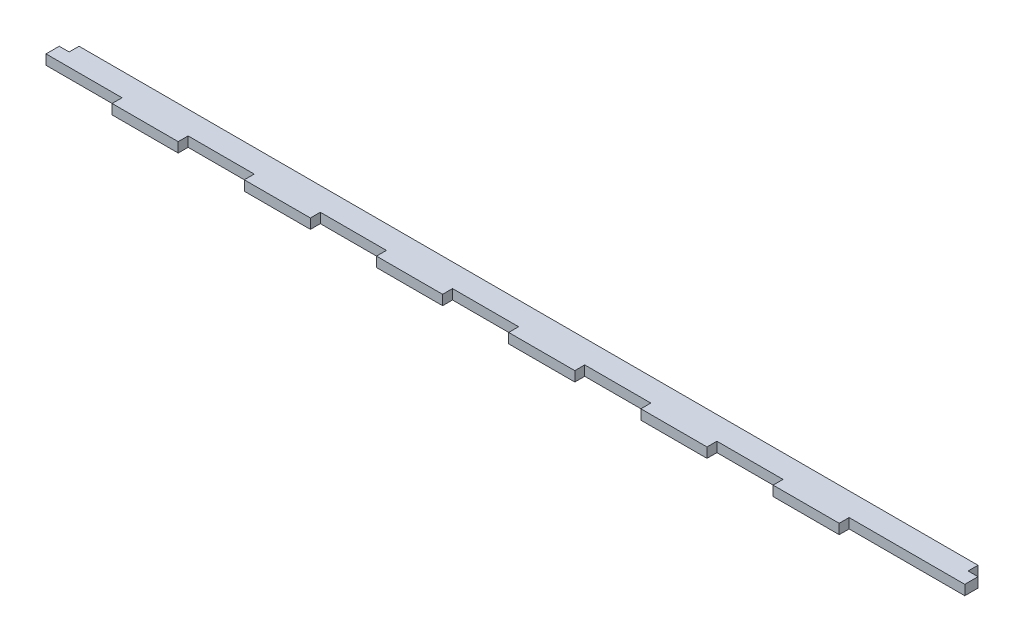
ISO-10303-21;
HEADER;
FILE_DESCRIPTION(('STEP AP214'),'2;1');
FILE_NAME('part.step','',(''),(''),'','','');
FILE_SCHEMA(('AUTOMOTIVE_DESIGN { 1 0 10303 214 1 1 1 1 }'));
ENDSEC;
DATA;
#1=APPLICATION_CONTEXT('core data for automotive mechanical design processes');
#2=APPLICATION_PROTOCOL_DEFINITION('international standard','automotive_design',2000,#1);
#3=PRODUCT_CONTEXT('',#1,'mechanical');
#4=PRODUCT('Part','Part','',(#3));
#5=PRODUCT_RELATED_PRODUCT_CATEGORY('part','',(#4));
#6=PRODUCT_DEFINITION_FORMATION('','',#4);
#7=PRODUCT_DEFINITION_CONTEXT('part definition',#1,'design');
#8=PRODUCT_DEFINITION('design','',#6,#7);
#9=PRODUCT_DEFINITION_SHAPE('','',#8);
#10=(LENGTH_UNIT() NAMED_UNIT(*) SI_UNIT(.MILLI.,.METRE.));
#11=(NAMED_UNIT(*) PLANE_ANGLE_UNIT() SI_UNIT($,.RADIAN.));
#12=(NAMED_UNIT(*) SI_UNIT($,.STERADIAN.) SOLID_ANGLE_UNIT());
#13=UNCERTAINTY_MEASURE_WITH_UNIT(LENGTH_MEASURE(1.E-05),#10,'distance_accuracy_value','');
#14=(GEOMETRIC_REPRESENTATION_CONTEXT(3) GLOBAL_UNCERTAINTY_ASSIGNED_CONTEXT((#13)) GLOBAL_UNIT_ASSIGNED_CONTEXT((#10,
#11,#12)) REPRESENTATION_CONTEXT('',''));
#15=CARTESIAN_POINT('',(0.,0.,0.));
#16=DIRECTION('',(0.,0.,1.));
#17=DIRECTION('',(1.,0.,0.));
#18=AXIS2_PLACEMENT_3D('',#15,#16,#17);
#19=CARTESIAN_POINT('',(0.,6.,0.));
#20=DIRECTION('',(1.,0.,0.));
#21=DIRECTION('',(0.,0.,-1.));
#22=AXIS2_PLACEMENT_3D('',#19,#20,#21);
#23=PLANE('',#22);
#24=DIRECTION('',(0.,-1.,0.));
#25=VECTOR('',#24,1.);
#26=CARTESIAN_POINT('',(0.,6.,-14.));
#27=LINE('',#26,#25);
#28=CARTESIAN_POINT('',(0.,6.,-14.));
#29=VERTEX_POINT('',#28);
#30=CARTESIAN_POINT('',(0.,0.,-14.));
#31=VERTEX_POINT('',#30);
#32=EDGE_CURVE('E56',#29,#31,#27,.T.);
#33=ORIENTED_EDGE('',*,*,#32,.F.);
#34=DIRECTION('',(0.,0.,1.));
#35=VECTOR('',#34,1.);
#36=CARTESIAN_POINT('',(0.,6.,0.));
#37=LINE('',#36,#35);
#38=CARTESIAN_POINT('',(0.,6.,-20.));
#39=VERTEX_POINT('',#38);
#40=EDGE_CURVE('E443',#39,#29,#37,.T.);
#41=ORIENTED_EDGE('',*,*,#40,.F.);
#42=DIRECTION('',(0.,-1.,0.));
#43=VECTOR('',#42,1.);
#44=CARTESIAN_POINT('',(0.,6.,-20.));
#45=LINE('',#44,#43);
#46=CARTESIAN_POINT('',(0.,0.,-20.));
#47=VERTEX_POINT('',#46);
#48=EDGE_CURVE('E41',#39,#47,#45,.T.);
#49=ORIENTED_EDGE('',*,*,#48,.T.);
#50=DIRECTION('',(0.,0.,1.));
#51=VECTOR('',#50,1.);
#52=CARTESIAN_POINT('',(0.,0.,0.));
#53=LINE('',#52,#51);
#54=EDGE_CURVE('E442',#47,#31,#53,.T.);
#55=ORIENTED_EDGE('',*,*,#54,.T.);
#56=EDGE_LOOP('',(#33,#41,#49,#55));
#57=FACE_BOUND('',#56,.T.);
#58=ADVANCED_FACE('F34',(#57),#23,.F.);
#59=CARTESIAN_POINT('',(0.,6.,0.));
#60=DIRECTION('',(0.,0.,-1.));
#61=DIRECTION('',(-1.,0.,0.));
#62=AXIS2_PLACEMENT_3D('',#59,#60,#61);
#63=PLANE('',#62);
#64=DIRECTION('',(0.,-1.,0.));
#65=VECTOR('',#64,1.);
#66=CARTESIAN_POINT('',(160.,6.,0.));
#67=LINE('',#66,#65);
#68=CARTESIAN_POINT('',(160.,6.,0.));
#69=VERTEX_POINT('',#68);
#70=CARTESIAN_POINT('',(160.,0.,0.));
#71=VERTEX_POINT('',#70);
#72=EDGE_CURVE('E320',#69,#71,#67,.T.);
#73=ORIENTED_EDGE('',*,*,#72,.F.);
#74=DIRECTION('',(1.,0.,0.));
#75=VECTOR('',#74,1.);
#76=CARTESIAN_POINT('',(0.,6.,0.));
#77=LINE('',#76,#75);
#78=CARTESIAN_POINT('',(120.,6.,0.));
#79=VERTEX_POINT('',#78);
#80=EDGE_CURVE('E451',#79,#69,#77,.T.);
#81=ORIENTED_EDGE('',*,*,#80,.F.);
#82=DIRECTION('',(0.,-1.,0.));
#83=VECTOR('',#82,1.);
#84=CARTESIAN_POINT('',(120.,6.,0.));
#85=LINE('',#84,#83);
#86=CARTESIAN_POINT('',(120.,0.,0.));
#87=VERTEX_POINT('',#86);
#88=EDGE_CURVE('E423',#79,#87,#85,.T.);
#89=ORIENTED_EDGE('',*,*,#88,.T.);
#90=DIRECTION('',(1.,0.,0.));
#91=VECTOR('',#90,1.);
#92=CARTESIAN_POINT('',(0.,0.,0.));
#93=LINE('',#92,#91);
#94=EDGE_CURVE('E461',#87,#71,#93,.T.);
#95=ORIENTED_EDGE('',*,*,#94,.T.);
#96=EDGE_LOOP('',(#73,#81,#89,#95));
#97=FACE_BOUND('',#96,.T.);
#98=ADVANCED_FACE('F495',(#97),#63,.F.);
#99=DIRECTION('',(0.,-1.,0.));
#100=VECTOR('',#99,1.);
#101=CARTESIAN_POINT('',(200.,6.,0.));
#102=LINE('',#101,#100);
#103=CARTESIAN_POINT('',(200.,6.,0.));
#104=VERTEX_POINT('',#103);
#105=CARTESIAN_POINT('',(200.,0.,0.));
#106=VERTEX_POINT('',#105);
#107=EDGE_CURVE('E317',#104,#106,#102,.T.);
#108=ORIENTED_EDGE('',*,*,#107,.T.);
#109=CARTESIAN_POINT('',(240.,0.,0.));
#110=VERTEX_POINT('',#109);
#111=EDGE_CURVE('E539',#106,#110,#93,.T.);
#112=ORIENTED_EDGE('',*,*,#111,.T.);
#113=DIRECTION('',(0.,-1.,0.));
#114=VECTOR('',#113,1.);
#115=CARTESIAN_POINT('',(240.,6.,0.));
#116=LINE('',#115,#114);
#117=CARTESIAN_POINT('',(240.,6.,0.));
#118=VERTEX_POINT('',#117);
#119=EDGE_CURVE('E308',#118,#110,#116,.T.);
#120=ORIENTED_EDGE('',*,*,#119,.F.);
#121=EDGE_CURVE('E564',#104,#118,#77,.T.);
#122=ORIENTED_EDGE('',*,*,#121,.F.);
#123=EDGE_LOOP('',(#108,#112,#120,#122));
#124=FACE_BOUND('',#123,.T.);
#125=ADVANCED_FACE('F499',(#124),#63,.F.);
#126=DIRECTION('',(0.,-1.,0.));
#127=VECTOR('',#126,1.);
#128=CARTESIAN_POINT('',(280.,6.,0.));
#129=LINE('',#128,#127);
#130=CARTESIAN_POINT('',(280.,6.,0.));
#131=VERTEX_POINT('',#130);
#132=CARTESIAN_POINT('',(280.,0.,0.));
#133=VERTEX_POINT('',#132);
#134=EDGE_CURVE('E344',#131,#133,#129,.T.);
#135=ORIENTED_EDGE('',*,*,#134,.T.);
#136=CARTESIAN_POINT('',(320.,0.,0.));
#137=VERTEX_POINT('',#136);
#138=EDGE_CURVE('E535',#133,#137,#93,.T.);
#139=ORIENTED_EDGE('',*,*,#138,.T.);
#140=DIRECTION('',(0.,-1.,0.));
#141=VECTOR('',#140,1.);
#142=CARTESIAN_POINT('',(320.,6.,0.));
#143=LINE('',#142,#141);
#144=CARTESIAN_POINT('',(320.,6.,0.));
#145=VERTEX_POINT('',#144);
#146=EDGE_CURVE('E335',#145,#137,#143,.T.);
#147=ORIENTED_EDGE('',*,*,#146,.F.);
#148=EDGE_CURVE('E565',#131,#145,#77,.T.);
#149=ORIENTED_EDGE('',*,*,#148,.F.);
#150=EDGE_LOOP('',(#135,#139,#147,#149));
#151=FACE_BOUND('',#150,.T.);
#152=ADVANCED_FACE('F505',(#151),#63,.F.);
#153=DIRECTION('',(0.,-1.,0.));
#154=VECTOR('',#153,1.);
#155=CARTESIAN_POINT('',(360.,6.,0.));
#156=LINE('',#155,#154);
#157=CARTESIAN_POINT('',(360.,6.,0.));
#158=VERTEX_POINT('',#157);
#159=CARTESIAN_POINT('',(360.,0.,0.));
#160=VERTEX_POINT('',#159);
#161=EDGE_CURVE('E369',#158,#160,#156,.T.);
#162=ORIENTED_EDGE('',*,*,#161,.T.);
#163=CARTESIAN_POINT('',(400.,0.,0.));
#164=VERTEX_POINT('',#163);
#165=EDGE_CURVE('E533',#160,#164,#93,.T.);
#166=ORIENTED_EDGE('',*,*,#165,.T.);
#167=DIRECTION('',(0.,-1.,0.));
#168=VECTOR('',#167,1.);
#169=CARTESIAN_POINT('',(400.,6.,0.));
#170=LINE('',#169,#168);
#171=CARTESIAN_POINT('',(400.,6.,0.));
#172=VERTEX_POINT('',#171);
#173=EDGE_CURVE('E360',#172,#164,#170,.T.);
#174=ORIENTED_EDGE('',*,*,#173,.F.);
#175=EDGE_CURVE('E568',#158,#172,#77,.T.);
#176=ORIENTED_EDGE('',*,*,#175,.F.);
#177=EDGE_LOOP('',(#162,#166,#174,#176));
#178=FACE_BOUND('',#177,.T.);
#179=ADVANCED_FACE('F519',(#178),#63,.F.);
#180=DIRECTION('',(0.,-1.,0.));
#181=VECTOR('',#180,1.);
#182=CARTESIAN_POINT('',(440.,6.,0.));
#183=LINE('',#182,#181);
#184=CARTESIAN_POINT('',(440.,6.,0.));
#185=VERTEX_POINT('',#184);
#186=CARTESIAN_POINT('',(440.,0.,0.));
#187=VERTEX_POINT('',#186);
#188=EDGE_CURVE('E394',#185,#187,#183,.T.);
#189=ORIENTED_EDGE('',*,*,#188,.T.);
#190=CARTESIAN_POINT('',(480.,0.,0.));
#191=VERTEX_POINT('',#190);
#192=EDGE_CURVE('E456',#187,#191,#93,.T.);
#193=ORIENTED_EDGE('',*,*,#192,.T.);
#194=DIRECTION('',(0.,-1.,0.));
#195=VECTOR('',#194,1.);
#196=CARTESIAN_POINT('',(480.,6.,0.));
#197=LINE('',#196,#195);
#198=CARTESIAN_POINT('',(480.,6.,0.));
#199=VERTEX_POINT('',#198);
#200=EDGE_CURVE('E385',#199,#191,#197,.T.);
#201=ORIENTED_EDGE('',*,*,#200,.F.);
#202=EDGE_CURVE('E445',#185,#199,#77,.T.);
#203=ORIENTED_EDGE('',*,*,#202,.F.);
#204=EDGE_LOOP('',(#189,#193,#201,#203));
#205=FACE_BOUND('',#204,.T.);
#206=ADVANCED_FACE('F511',(#205),#63,.F.);
#207=CARTESIAN_POINT('',(0.,6.,0.));
#208=DIRECTION('',(0.,-1.,0.));
#209=DIRECTION('',(0.,0.,-1.));
#210=AXIS2_PLACEMENT_3D('',#207,#208,#209);
#211=PLANE('',#210);
#212=DIRECTION('',(-1.,0.,0.));
#213=VECTOR('',#212,1.);
#214=CARTESIAN_POINT('',(480.,6.,-5.99999999999999));
#215=LINE('',#214,#213);
#216=CARTESIAN_POINT('',(550.,6.,-6.));
#217=VERTEX_POINT('',#216);
#218=CARTESIAN_POINT('',(480.,6.,-5.99999999999999));
#219=VERTEX_POINT('',#218);
#220=EDGE_CURVE('E244',#217,#219,#215,.T.);
#221=ORIENTED_EDGE('',*,*,#220,.F.);
#222=DIRECTION('',(0.,0.,-1.));
#223=VECTOR('',#222,1.);
#224=CARTESIAN_POINT('',(550.,6.,-6.));
#225=LINE('',#224,#223);
#226=CARTESIAN_POINT('',(550.,6.,-14.));
#227=VERTEX_POINT('',#226);
#228=EDGE_CURVE('E248',#217,#227,#225,.T.);
#229=ORIENTED_EDGE('',*,*,#228,.T.);
#230=DIRECTION('',(-1.,0.,0.));
#231=VECTOR('',#230,1.);
#232=CARTESIAN_POINT('',(544.,6.,-14.));
#233=LINE('',#232,#231);
#234=CARTESIAN_POINT('',(544.,6.,-14.));
#235=VERTEX_POINT('',#234);
#236=EDGE_CURVE('E269',#227,#235,#233,.T.);
#237=ORIENTED_EDGE('',*,*,#236,.T.);
#238=DIRECTION('',(0.,0.,-1.));
#239=VECTOR('',#238,1.);
#240=CARTESIAN_POINT('',(544.,6.,0.));
#241=LINE('',#240,#239);
#242=CARTESIAN_POINT('',(544.,6.,-20.));
#243=VERTEX_POINT('',#242);
#244=EDGE_CURVE('E450',#235,#243,#241,.T.);
#245=ORIENTED_EDGE('',*,*,#244,.T.);
#246=DIRECTION('',(-1.,0.,0.));
#247=VECTOR('',#246,1.);
#248=CARTESIAN_POINT('',(0.,6.,-20.));
#249=LINE('',#248,#247);
#250=EDGE_CURVE('E453',#243,#39,#249,.T.);
#251=ORIENTED_EDGE('',*,*,#250,.T.);
#252=ORIENTED_EDGE('',*,*,#40,.T.);
#253=DIRECTION('',(-1.,0.,0.));
#254=VECTOR('',#253,1.);
#255=CARTESIAN_POINT('',(0.,6.,-14.));
#256=LINE('',#255,#254);
#257=CARTESIAN_POINT('',(-6.,6.,-14.));
#258=VERTEX_POINT('',#257);
#259=EDGE_CURVE('E279',#29,#258,#256,.T.);
#260=ORIENTED_EDGE('',*,*,#259,.T.);
#261=DIRECTION('',(0.,0.,1.));
#262=VECTOR('',#261,1.);
#263=CARTESIAN_POINT('',(-6.,6.,-14.));
#264=LINE('',#263,#262);
#265=CARTESIAN_POINT('',(-6.,6.,-6.));
#266=VERTEX_POINT('',#265);
#267=EDGE_CURVE('E281',#258,#266,#264,.T.);
#268=ORIENTED_EDGE('',*,*,#267,.T.);
#269=DIRECTION('',(-1.,0.,0.));
#270=VECTOR('',#269,1.);
#271=CARTESIAN_POINT('',(0.,6.,-5.99999999999999));
#272=LINE('',#271,#270);
#273=CARTESIAN_POINT('',(40.,6.,-6.));
#274=VERTEX_POINT('',#273);
#275=EDGE_CURVE('E431',#274,#266,#272,.T.);
#276=ORIENTED_EDGE('',*,*,#275,.F.);
#277=DIRECTION('',(0.,0.,-1.));
#278=VECTOR('',#277,1.);
#279=CARTESIAN_POINT('',(40.,6.,0.));
#280=LINE('',#279,#278);
#281=CARTESIAN_POINT('',(40.,6.,0.));
#282=VERTEX_POINT('',#281);
#283=EDGE_CURVE('E429',#282,#274,#280,.T.);
#284=ORIENTED_EDGE('',*,*,#283,.F.);
#285=CARTESIAN_POINT('',(80.,6.,0.));
#286=VERTEX_POINT('',#285);
#287=EDGE_CURVE('E447',#282,#286,#77,.T.);
#288=ORIENTED_EDGE('',*,*,#287,.T.);
#289=DIRECTION('',(0.,0.,1.));
#290=VECTOR('',#289,1.);
#291=CARTESIAN_POINT('',(80.,6.,0.));
#292=LINE('',#291,#290);
#293=CARTESIAN_POINT('',(80.,6.,-5.99999999999999));
#294=VERTEX_POINT('',#293);
#295=EDGE_CURVE('E404',#294,#286,#292,.T.);
#296=ORIENTED_EDGE('',*,*,#295,.F.);
#297=DIRECTION('',(-1.,0.,0.));
#298=VECTOR('',#297,1.);
#299=CARTESIAN_POINT('',(80.,6.,-5.99999999999999));
#300=LINE('',#299,#298);
#301=CARTESIAN_POINT('',(120.,6.,-6.));
#302=VERTEX_POINT('',#301);
#303=EDGE_CURVE('E409',#302,#294,#300,.T.);
#304=ORIENTED_EDGE('',*,*,#303,.F.);
#305=DIRECTION('',(0.,0.,-1.));
#306=VECTOR('',#305,1.);
#307=CARTESIAN_POINT('',(120.,6.,0.));
#308=LINE('',#307,#306);
#309=EDGE_CURVE('E406',#79,#302,#308,.T.);
#310=ORIENTED_EDGE('',*,*,#309,.F.);
#311=ORIENTED_EDGE('',*,*,#80,.T.);
#312=DIRECTION('',(0.,0.,1.));
#313=VECTOR('',#312,1.);
#314=CARTESIAN_POINT('',(160.,6.,0.));
#315=LINE('',#314,#313);
#316=CARTESIAN_POINT('',(160.,6.,-5.99999999999999));
#317=VERTEX_POINT('',#316);
#318=EDGE_CURVE('E296',#317,#69,#315,.T.);
#319=ORIENTED_EDGE('',*,*,#318,.F.);
#320=DIRECTION('',(-1.,0.,0.));
#321=VECTOR('',#320,1.);
#322=CARTESIAN_POINT('',(160.,6.,-5.99999999999999));
#323=LINE('',#322,#321);
#324=CARTESIAN_POINT('',(200.,6.,-6.));
#325=VERTEX_POINT('',#324);
#326=EDGE_CURVE('E301',#325,#317,#323,.T.);
#327=ORIENTED_EDGE('',*,*,#326,.F.);
#328=DIRECTION('',(0.,0.,-1.));
#329=VECTOR('',#328,1.);
#330=CARTESIAN_POINT('',(200.,6.,0.));
#331=LINE('',#330,#329);
#332=EDGE_CURVE('E298',#104,#325,#331,.T.);
#333=ORIENTED_EDGE('',*,*,#332,.F.);
#334=ORIENTED_EDGE('',*,*,#121,.T.);
#335=DIRECTION('',(0.,0.,1.));
#336=VECTOR('',#335,1.);
#337=CARTESIAN_POINT('',(240.,6.,0.));
#338=LINE('',#337,#336);
#339=CARTESIAN_POINT('',(240.,6.,-5.99999999999999));
#340=VERTEX_POINT('',#339);
#341=EDGE_CURVE('E323',#340,#118,#338,.T.);
#342=ORIENTED_EDGE('',*,*,#341,.F.);
#343=DIRECTION('',(-1.,0.,0.));
#344=VECTOR('',#343,1.);
#345=CARTESIAN_POINT('',(240.,6.,-5.99999999999999));
#346=LINE('',#345,#344);
#347=CARTESIAN_POINT('',(280.,6.,-6.));
#348=VERTEX_POINT('',#347);
#349=EDGE_CURVE('E328',#348,#340,#346,.T.);
#350=ORIENTED_EDGE('',*,*,#349,.F.);
#351=DIRECTION('',(0.,0.,-1.));
#352=VECTOR('',#351,1.);
#353=CARTESIAN_POINT('',(280.,6.,0.));
#354=LINE('',#353,#352);
#355=EDGE_CURVE('E325',#131,#348,#354,.T.);
#356=ORIENTED_EDGE('',*,*,#355,.F.);
#357=ORIENTED_EDGE('',*,*,#148,.T.);
#358=DIRECTION('',(0.,0.,1.));
#359=VECTOR('',#358,1.);
#360=CARTESIAN_POINT('',(320.,6.,0.));
#361=LINE('',#360,#359);
#362=CARTESIAN_POINT('',(320.,6.,-5.99999999999999));
#363=VERTEX_POINT('',#362);
#364=EDGE_CURVE('E348',#363,#145,#361,.T.);
#365=ORIENTED_EDGE('',*,*,#364,.F.);
#366=DIRECTION('',(-1.,0.,0.));
#367=VECTOR('',#366,1.);
#368=CARTESIAN_POINT('',(320.,6.,-5.99999999999999));
#369=LINE('',#368,#367);
#370=CARTESIAN_POINT('',(360.,6.,-6.));
#371=VERTEX_POINT('',#370);
#372=EDGE_CURVE('E353',#371,#363,#369,.T.);
#373=ORIENTED_EDGE('',*,*,#372,.F.);
#374=DIRECTION('',(0.,0.,-1.));
#375=VECTOR('',#374,1.);
#376=CARTESIAN_POINT('',(360.,6.,0.));
#377=LINE('',#376,#375);
#378=EDGE_CURVE('E350',#158,#371,#377,.T.);
#379=ORIENTED_EDGE('',*,*,#378,.F.);
#380=ORIENTED_EDGE('',*,*,#175,.T.);
#381=DIRECTION('',(0.,0.,1.));
#382=VECTOR('',#381,1.);
#383=CARTESIAN_POINT('',(400.,6.,0.));
#384=LINE('',#383,#382);
#385=CARTESIAN_POINT('',(400.,6.,-5.99999999999999));
#386=VERTEX_POINT('',#385);
#387=EDGE_CURVE('E373',#386,#172,#384,.T.);
#388=ORIENTED_EDGE('',*,*,#387,.F.);
#389=DIRECTION('',(-1.,0.,0.));
#390=VECTOR('',#389,1.);
#391=CARTESIAN_POINT('',(400.,6.,-5.99999999999999));
#392=LINE('',#391,#390);
#393=CARTESIAN_POINT('',(440.,6.,-6.));
#394=VERTEX_POINT('',#393);
#395=EDGE_CURVE('E378',#394,#386,#392,.T.);
#396=ORIENTED_EDGE('',*,*,#395,.F.);
#397=DIRECTION('',(0.,0.,-1.));
#398=VECTOR('',#397,1.);
#399=CARTESIAN_POINT('',(440.,6.,0.));
#400=LINE('',#399,#398);
#401=EDGE_CURVE('E375',#185,#394,#400,.T.);
#402=ORIENTED_EDGE('',*,*,#401,.F.);
#403=ORIENTED_EDGE('',*,*,#202,.T.);
#404=DIRECTION('',(0.,0.,1.));
#405=VECTOR('',#404,1.);
#406=CARTESIAN_POINT('',(480.,6.,0.));
#407=LINE('',#406,#405);
#408=EDGE_CURVE('E251',#219,#199,#407,.T.);
#409=ORIENTED_EDGE('',*,*,#408,.F.);
#410=EDGE_LOOP('',(#221,#229,#237,#245,#251,#252,#260,#268,#276,#284,#288,#296,#304,#310,#311,
#319,#327,#333,#334,#342,#350,#356,#357,#365,#373,#379,#380,#388,#396,#402,#403,#409));
#411=FACE_BOUND('',#410,.T.);
#412=ADVANCED_FACE('F246',(#411),#211,.F.);
#413=CARTESIAN_POINT('',(0.,0.,0.));
#414=DIRECTION('',(0.,-1.,0.));
#415=DIRECTION('',(0.,0.,-1.));
#416=AXIS2_PLACEMENT_3D('',#413,#414,#415);
#417=PLANE('',#416);
#418=DIRECTION('',(0.,0.,-1.));
#419=VECTOR('',#418,1.);
#420=CARTESIAN_POINT('',(544.,0.,0.));
#421=LINE('',#420,#419);
#422=CARTESIAN_POINT('',(544.,0.,-14.));
#423=VERTEX_POINT('',#422);
#424=CARTESIAN_POINT('',(544.,0.,-20.));
#425=VERTEX_POINT('',#424);
#426=EDGE_CURVE('E460',#423,#425,#421,.T.);
#427=ORIENTED_EDGE('',*,*,#426,.F.);
#428=DIRECTION('',(-1.,0.,0.));
#429=VECTOR('',#428,1.);
#430=CARTESIAN_POINT('',(544.,0.,-14.));
#431=LINE('',#430,#429);
#432=CARTESIAN_POINT('',(550.,0.,-14.));
#433=VERTEX_POINT('',#432);
#434=EDGE_CURVE('E48',#433,#423,#431,.T.);
#435=ORIENTED_EDGE('',*,*,#434,.F.);
#436=DIRECTION('',(0.,0.,-1.));
#437=VECTOR('',#436,1.);
#438=CARTESIAN_POINT('',(550.,0.,-6.));
#439=LINE('',#438,#437);
#440=CARTESIAN_POINT('',(550.,0.,-6.));
#441=VERTEX_POINT('',#440);
#442=EDGE_CURVE('E273',#441,#433,#439,.T.);
#443=ORIENTED_EDGE('',*,*,#442,.F.);
#444=DIRECTION('',(-1.,0.,0.));
#445=VECTOR('',#444,1.);
#446=CARTESIAN_POINT('',(480.,0.,-5.99999999999999));
#447=LINE('',#446,#445);
#448=CARTESIAN_POINT('',(480.,0.,-5.99999999999999));
#449=VERTEX_POINT('',#448);
#450=EDGE_CURVE('E261',#441,#449,#447,.T.);
#451=ORIENTED_EDGE('',*,*,#450,.T.);
#452=DIRECTION('',(0.,0.,1.));
#453=VECTOR('',#452,1.);
#454=CARTESIAN_POINT('',(480.,0.,0.));
#455=LINE('',#454,#453);
#456=EDGE_CURVE('E295',#449,#191,#455,.T.);
#457=ORIENTED_EDGE('',*,*,#456,.T.);
#458=ORIENTED_EDGE('',*,*,#192,.F.);
#459=DIRECTION('',(0.,0.,-1.));
#460=VECTOR('',#459,1.);
#461=CARTESIAN_POINT('',(440.,0.,0.));
#462=LINE('',#461,#460);
#463=CARTESIAN_POINT('',(440.,0.,-6.));
#464=VERTEX_POINT('',#463);
#465=EDGE_CURVE('E384',#187,#464,#462,.T.);
#466=ORIENTED_EDGE('',*,*,#465,.T.);
#467=DIRECTION('',(-1.,0.,0.));
#468=VECTOR('',#467,1.);
#469=CARTESIAN_POINT('',(400.,0.,-5.99999999999999));
#470=LINE('',#469,#468);
#471=CARTESIAN_POINT('',(400.,0.,-5.99999999999999));
#472=VERTEX_POINT('',#471);
#473=EDGE_CURVE('E376',#464,#472,#470,.T.);
#474=ORIENTED_EDGE('',*,*,#473,.T.);
#475=DIRECTION('',(0.,0.,1.));
#476=VECTOR('',#475,1.);
#477=CARTESIAN_POINT('',(400.,0.,0.));
#478=LINE('',#477,#476);
#479=EDGE_CURVE('E381',#472,#164,#478,.T.);
#480=ORIENTED_EDGE('',*,*,#479,.T.);
#481=ORIENTED_EDGE('',*,*,#165,.F.);
#482=DIRECTION('',(0.,0.,-1.));
#483=VECTOR('',#482,1.);
#484=CARTESIAN_POINT('',(360.,0.,0.));
#485=LINE('',#484,#483);
#486=CARTESIAN_POINT('',(360.,0.,-6.));
#487=VERTEX_POINT('',#486);
#488=EDGE_CURVE('E359',#160,#487,#485,.T.);
#489=ORIENTED_EDGE('',*,*,#488,.T.);
#490=DIRECTION('',(-1.,0.,0.));
#491=VECTOR('',#490,1.);
#492=CARTESIAN_POINT('',(320.,0.,-5.99999999999999));
#493=LINE('',#492,#491);
#494=CARTESIAN_POINT('',(320.,0.,-5.99999999999999));
#495=VERTEX_POINT('',#494);
#496=EDGE_CURVE('E351',#487,#495,#493,.T.);
#497=ORIENTED_EDGE('',*,*,#496,.T.);
#498=DIRECTION('',(0.,0.,1.));
#499=VECTOR('',#498,1.);
#500=CARTESIAN_POINT('',(320.,0.,0.));
#501=LINE('',#500,#499);
#502=EDGE_CURVE('E356',#495,#137,#501,.T.);
#503=ORIENTED_EDGE('',*,*,#502,.T.);
#504=ORIENTED_EDGE('',*,*,#138,.F.);
#505=DIRECTION('',(0.,0.,-1.));
#506=VECTOR('',#505,1.);
#507=CARTESIAN_POINT('',(280.,0.,0.));
#508=LINE('',#507,#506);
#509=CARTESIAN_POINT('',(280.,0.,-6.));
#510=VERTEX_POINT('',#509);
#511=EDGE_CURVE('E334',#133,#510,#508,.T.);
#512=ORIENTED_EDGE('',*,*,#511,.T.);
#513=DIRECTION('',(-1.,0.,0.));
#514=VECTOR('',#513,1.);
#515=CARTESIAN_POINT('',(240.,0.,-5.99999999999999));
#516=LINE('',#515,#514);
#517=CARTESIAN_POINT('',(240.,0.,-5.99999999999999));
#518=VERTEX_POINT('',#517);
#519=EDGE_CURVE('E326',#510,#518,#516,.T.);
#520=ORIENTED_EDGE('',*,*,#519,.T.);
#521=DIRECTION('',(0.,0.,1.));
#522=VECTOR('',#521,1.);
#523=CARTESIAN_POINT('',(240.,0.,0.));
#524=LINE('',#523,#522);
#525=EDGE_CURVE('E331',#518,#110,#524,.T.);
#526=ORIENTED_EDGE('',*,*,#525,.T.);
#527=ORIENTED_EDGE('',*,*,#111,.F.);
#528=DIRECTION('',(0.,0.,-1.));
#529=VECTOR('',#528,1.);
#530=CARTESIAN_POINT('',(200.,0.,0.));
#531=LINE('',#530,#529);
#532=CARTESIAN_POINT('',(200.,0.,-6.));
#533=VERTEX_POINT('',#532);
#534=EDGE_CURVE('E307',#106,#533,#531,.T.);
#535=ORIENTED_EDGE('',*,*,#534,.T.);
#536=DIRECTION('',(-1.,0.,0.));
#537=VECTOR('',#536,1.);
#538=CARTESIAN_POINT('',(160.,0.,-5.99999999999999));
#539=LINE('',#538,#537);
#540=CARTESIAN_POINT('',(160.,0.,-5.99999999999999));
#541=VERTEX_POINT('',#540);
#542=EDGE_CURVE('E299',#533,#541,#539,.T.);
#543=ORIENTED_EDGE('',*,*,#542,.T.);
#544=DIRECTION('',(0.,0.,1.));
#545=VECTOR('',#544,1.);
#546=CARTESIAN_POINT('',(160.,0.,0.));
#547=LINE('',#546,#545);
#548=EDGE_CURVE('E304',#541,#71,#547,.T.);
#549=ORIENTED_EDGE('',*,*,#548,.T.);
#550=ORIENTED_EDGE('',*,*,#94,.F.);
#551=DIRECTION('',(0.,0.,-1.));
#552=VECTOR('',#551,1.);
#553=CARTESIAN_POINT('',(120.,0.,0.));
#554=LINE('',#553,#552);
#555=CARTESIAN_POINT('',(120.,0.,-6.));
#556=VERTEX_POINT('',#555);
#557=EDGE_CURVE('E414',#87,#556,#554,.T.);
#558=ORIENTED_EDGE('',*,*,#557,.T.);
#559=DIRECTION('',(-1.,0.,0.));
#560=VECTOR('',#559,1.);
#561=CARTESIAN_POINT('',(80.,0.,-5.99999999999999));
#562=LINE('',#561,#560);
#563=CARTESIAN_POINT('',(80.,0.,-5.99999999999999));
#564=VERTEX_POINT('',#563);
#565=EDGE_CURVE('E407',#556,#564,#562,.T.);
#566=ORIENTED_EDGE('',*,*,#565,.T.);
#567=DIRECTION('',(0.,0.,1.));
#568=VECTOR('',#567,1.);
#569=CARTESIAN_POINT('',(80.,0.,0.));
#570=LINE('',#569,#568);
#571=CARTESIAN_POINT('',(80.,0.,0.));
#572=VERTEX_POINT('',#571);
#573=EDGE_CURVE('E322',#564,#572,#570,.T.);
#574=ORIENTED_EDGE('',*,*,#573,.T.);
#575=CARTESIAN_POINT('',(40.,0.,0.));
#576=VERTEX_POINT('',#575);
#577=EDGE_CURVE('E457',#576,#572,#93,.T.);
#578=ORIENTED_EDGE('',*,*,#577,.F.);
#579=DIRECTION('',(0.,0.,-1.));
#580=VECTOR('',#579,1.);
#581=CARTESIAN_POINT('',(40.,0.,0.));
#582=LINE('',#581,#580);
#583=CARTESIAN_POINT('',(40.,0.,-6.));
#584=VERTEX_POINT('',#583);
#585=EDGE_CURVE('E428',#576,#584,#582,.T.);
#586=ORIENTED_EDGE('',*,*,#585,.T.);
#587=DIRECTION('',(-1.,0.,0.));
#588=VECTOR('',#587,1.);
#589=CARTESIAN_POINT('',(0.,0.,-5.99999999999999));
#590=LINE('',#589,#588);
#591=CARTESIAN_POINT('',(-6.,0.,-6.));
#592=VERTEX_POINT('',#591);
#593=EDGE_CURVE('E432',#584,#592,#590,.T.);
#594=ORIENTED_EDGE('',*,*,#593,.T.);
#595=DIRECTION('',(0.,0.,1.));
#596=VECTOR('',#595,1.);
#597=CARTESIAN_POINT('',(-6.,0.,-14.));
#598=LINE('',#597,#596);
#599=CARTESIAN_POINT('',(-6.,0.,-14.));
#600=VERTEX_POINT('',#599);
#601=EDGE_CURVE('E282',#600,#592,#598,.T.);
#602=ORIENTED_EDGE('',*,*,#601,.F.);
#603=DIRECTION('',(-1.,0.,0.));
#604=VECTOR('',#603,1.);
#605=CARTESIAN_POINT('',(0.,0.,-14.));
#606=LINE('',#605,#604);
#607=EDGE_CURVE('E264',#31,#600,#606,.T.);
#608=ORIENTED_EDGE('',*,*,#607,.F.);
#609=ORIENTED_EDGE('',*,*,#54,.F.);
#610=DIRECTION('',(-1.,0.,0.));
#611=VECTOR('',#610,1.);
#612=CARTESIAN_POINT('',(0.,0.,-20.));
#613=LINE('',#612,#611);
#614=EDGE_CURVE('E446',#425,#47,#613,.T.);
#615=ORIENTED_EDGE('',*,*,#614,.F.);
#616=EDGE_LOOP('',(#427,#435,#443,#451,#457,#458,#466,#474,#480,#481,#489,#497,#503,#504,#512,
#520,#526,#527,#535,#543,#549,#550,#558,#566,#574,#578,#586,#594,#602,#608,#609,#615));
#617=FACE_BOUND('',#616,.T.);
#618=ADVANCED_FACE('F472',(#617),#417,.T.);
#619=DIRECTION('',(0.,-1.,0.));
#620=VECTOR('',#619,1.);
#621=CARTESIAN_POINT('',(80.,6.,0.));
#622=LINE('',#621,#620);
#623=EDGE_CURVE('E426',#286,#572,#622,.T.);
#624=ORIENTED_EDGE('',*,*,#623,.F.);
#625=ORIENTED_EDGE('',*,*,#287,.F.);
#626=DIRECTION('',(0.,-1.,0.));
#627=VECTOR('',#626,1.);
#628=CARTESIAN_POINT('',(40.,6.,0.));
#629=LINE('',#628,#627);
#630=EDGE_CURVE('E439',#282,#576,#629,.T.);
#631=ORIENTED_EDGE('',*,*,#630,.T.);
#632=ORIENTED_EDGE('',*,*,#577,.T.);
#633=EDGE_LOOP('',(#624,#625,#631,#632));
#634=FACE_BOUND('',#633,.T.);
#635=ADVANCED_FACE('F501',(#634),#63,.F.);
#636=CARTESIAN_POINT('',(544.,6.,0.));
#637=DIRECTION('',(-1.,0.,0.));
#638=DIRECTION('',(0.,0.,1.));
#639=AXIS2_PLACEMENT_3D('',#636,#637,#638);
#640=PLANE('',#639);
#641=ORIENTED_EDGE('',*,*,#244,.F.);
#642=DIRECTION('',(0.,-1.,0.));
#643=VECTOR('',#642,1.);
#644=CARTESIAN_POINT('',(544.,6.,-14.));
#645=LINE('',#644,#643);
#646=EDGE_CURVE('E271',#235,#423,#645,.T.);
#647=ORIENTED_EDGE('',*,*,#646,.T.);
#648=ORIENTED_EDGE('',*,*,#426,.T.);
#649=DIRECTION('',(0.,-1.,0.));
#650=VECTOR('',#649,1.);
#651=CARTESIAN_POINT('',(544.,6.,-20.));
#652=LINE('',#651,#650);
#653=EDGE_CURVE('E11',#243,#425,#652,.T.);
#654=ORIENTED_EDGE('',*,*,#653,.F.);
#655=EDGE_LOOP('',(#641,#647,#648,#654));
#656=FACE_BOUND('',#655,.T.);
#657=ADVANCED_FACE('F485',(#656),#640,.F.);
#658=CARTESIAN_POINT('',(0.,6.,-20.));
#659=DIRECTION('',(0.,0.,1.));
#660=DIRECTION('',(1.,0.,0.));
#661=AXIS2_PLACEMENT_3D('',#658,#659,#660);
#662=PLANE('',#661);
#663=ORIENTED_EDGE('',*,*,#614,.T.);
#664=ORIENTED_EDGE('',*,*,#48,.F.);
#665=ORIENTED_EDGE('',*,*,#250,.F.);
#666=ORIENTED_EDGE('',*,*,#653,.T.);
#667=EDGE_LOOP('',(#663,#664,#665,#666));
#668=FACE_BOUND('',#667,.T.);
#669=ADVANCED_FACE('F483',(#668),#662,.F.);
#670=CARTESIAN_POINT('',(40.,6.,0.));
#671=DIRECTION('',(-1.,0.,0.));
#672=DIRECTION('',(0.,0.,1.));
#673=AXIS2_PLACEMENT_3D('',#670,#671,#672);
#674=PLANE('',#673);
#675=ORIENTED_EDGE('',*,*,#585,.F.);
#676=ORIENTED_EDGE('',*,*,#630,.F.);
#677=ORIENTED_EDGE('',*,*,#283,.T.);
#678=DIRECTION('',(0.,-1.,0.));
#679=VECTOR('',#678,1.);
#680=CARTESIAN_POINT('',(40.,6.,-6.));
#681=LINE('',#680,#679);
#682=EDGE_CURVE('E434',#274,#584,#681,.T.);
#683=ORIENTED_EDGE('',*,*,#682,.T.);
#684=EDGE_LOOP('',(#675,#676,#677,#683));
#685=FACE_BOUND('',#684,.T.);
#686=ADVANCED_FACE('F802',(#685),#674,.T.);
#687=CARTESIAN_POINT('',(0.,6.,-5.99999999999999));
#688=DIRECTION('',(0.,0.,1.));
#689=DIRECTION('',(1.,0.,0.));
#690=AXIS2_PLACEMENT_3D('',#687,#688,#689);
#691=PLANE('',#690);
#692=ORIENTED_EDGE('',*,*,#593,.F.);
#693=ORIENTED_EDGE('',*,*,#682,.F.);
#694=ORIENTED_EDGE('',*,*,#275,.T.);
#695=DIRECTION('',(0.,-1.,0.));
#696=VECTOR('',#695,1.);
#697=CARTESIAN_POINT('',(-6.,6.,-6.));
#698=LINE('',#697,#696);
#699=EDGE_CURVE('E285',#266,#592,#698,.T.);
#700=ORIENTED_EDGE('',*,*,#699,.T.);
#701=EDGE_LOOP('',(#692,#693,#694,#700));
#702=FACE_BOUND('',#701,.T.);
#703=ADVANCED_FACE('F630',(#702),#691,.T.);
#704=CARTESIAN_POINT('',(80.,6.,0.));
#705=DIRECTION('',(1.,0.,0.));
#706=DIRECTION('',(0.,0.,-1.));
#707=AXIS2_PLACEMENT_3D('',#704,#705,#706);
#708=PLANE('',#707);
#709=ORIENTED_EDGE('',*,*,#573,.F.);
#710=DIRECTION('',(0.,-1.,0.));
#711=VECTOR('',#710,1.);
#712=CARTESIAN_POINT('',(80.,6.,-5.99999999999999));
#713=LINE('',#712,#711);
#714=EDGE_CURVE('E411',#294,#564,#713,.T.);
#715=ORIENTED_EDGE('',*,*,#714,.F.);
#716=ORIENTED_EDGE('',*,*,#295,.T.);
#717=ORIENTED_EDGE('',*,*,#623,.T.);
#718=EDGE_LOOP('',(#709,#715,#716,#717));
#719=FACE_BOUND('',#718,.T.);
#720=ADVANCED_FACE('F624',(#719),#708,.T.);
#721=CARTESIAN_POINT('',(120.,6.,0.));
#722=DIRECTION('',(-1.,0.,0.));
#723=DIRECTION('',(0.,0.,1.));
#724=AXIS2_PLACEMENT_3D('',#721,#722,#723);
#725=PLANE('',#724);
#726=ORIENTED_EDGE('',*,*,#557,.F.);
#727=ORIENTED_EDGE('',*,*,#88,.F.);
#728=ORIENTED_EDGE('',*,*,#309,.T.);
#729=DIRECTION('',(0.,-1.,0.));
#730=VECTOR('',#729,1.);
#731=CARTESIAN_POINT('',(120.,6.,-6.));
#732=LINE('',#731,#730);
#733=EDGE_CURVE('E421',#302,#556,#732,.T.);
#734=ORIENTED_EDGE('',*,*,#733,.T.);
#735=EDGE_LOOP('',(#726,#727,#728,#734));
#736=FACE_BOUND('',#735,.T.);
#737=ADVANCED_FACE('F629',(#736),#725,.T.);
#738=CARTESIAN_POINT('',(80.,6.,-5.99999999999999));
#739=DIRECTION('',(0.,0.,1.));
#740=DIRECTION('',(1.,0.,0.));
#741=AXIS2_PLACEMENT_3D('',#738,#739,#740);
#742=PLANE('',#741);
#743=ORIENTED_EDGE('',*,*,#565,.F.);
#744=ORIENTED_EDGE('',*,*,#733,.F.);
#745=ORIENTED_EDGE('',*,*,#303,.T.);
#746=ORIENTED_EDGE('',*,*,#714,.T.);
#747=EDGE_LOOP('',(#743,#744,#745,#746));
#748=FACE_BOUND('',#747,.T.);
#749=ADVANCED_FACE('F642',(#748),#742,.T.);
#750=CARTESIAN_POINT('',(480.,6.,0.));
#751=DIRECTION('',(1.,0.,0.));
#752=DIRECTION('',(0.,0.,-1.));
#753=AXIS2_PLACEMENT_3D('',#750,#751,#752);
#754=PLANE('',#753);
#755=ORIENTED_EDGE('',*,*,#456,.F.);
#756=DIRECTION('',(0.,-1.,0.));
#757=VECTOR('',#756,1.);
#758=CARTESIAN_POINT('',(480.,6.,-5.99999999999999));
#759=LINE('',#758,#757);
#760=EDGE_CURVE('E255',#219,#449,#759,.T.);
#761=ORIENTED_EDGE('',*,*,#760,.F.);
#762=ORIENTED_EDGE('',*,*,#408,.T.);
#763=ORIENTED_EDGE('',*,*,#200,.T.);
#764=EDGE_LOOP('',(#755,#761,#762,#763));
#765=FACE_BOUND('',#764,.T.);
#766=ADVANCED_FACE('F652',(#765),#754,.T.);
#767=CARTESIAN_POINT('',(480.,6.,-5.99999999999999));
#768=DIRECTION('',(0.,0.,1.));
#769=DIRECTION('',(1.,0.,0.));
#770=AXIS2_PLACEMENT_3D('',#767,#768,#769);
#771=PLANE('',#770);
#772=ORIENTED_EDGE('',*,*,#450,.F.);
#773=DIRECTION('',(0.,-1.,0.));
#774=VECTOR('',#773,1.);
#775=CARTESIAN_POINT('',(550.,6.,-6.));
#776=LINE('',#775,#774);
#777=EDGE_CURVE('E258',#217,#441,#776,.T.);
#778=ORIENTED_EDGE('',*,*,#777,.F.);
#779=ORIENTED_EDGE('',*,*,#220,.T.);
#780=ORIENTED_EDGE('',*,*,#760,.T.);
#781=EDGE_LOOP('',(#772,#778,#779,#780));
#782=FACE_BOUND('',#781,.T.);
#783=ADVANCED_FACE('F259',(#782),#771,.T.);
#784=CARTESIAN_POINT('',(400.,6.,0.));
#785=DIRECTION('',(1.,0.,0.));
#786=DIRECTION('',(0.,0.,-1.));
#787=AXIS2_PLACEMENT_3D('',#784,#785,#786);
#788=PLANE('',#787);
#789=ORIENTED_EDGE('',*,*,#479,.F.);
#790=DIRECTION('',(0.,-1.,0.));
#791=VECTOR('',#790,1.);
#792=CARTESIAN_POINT('',(400.,6.,-5.99999999999999));
#793=LINE('',#792,#791);
#794=EDGE_CURVE('E380',#386,#472,#793,.T.);
#795=ORIENTED_EDGE('',*,*,#794,.F.);
#796=ORIENTED_EDGE('',*,*,#387,.T.);
#797=ORIENTED_EDGE('',*,*,#173,.T.);
#798=EDGE_LOOP('',(#789,#795,#796,#797));
#799=FACE_BOUND('',#798,.T.);
#800=ADVANCED_FACE('F584',(#799),#788,.T.);
#801=CARTESIAN_POINT('',(440.,6.,0.));
#802=DIRECTION('',(-1.,0.,0.));
#803=DIRECTION('',(0.,0.,1.));
#804=AXIS2_PLACEMENT_3D('',#801,#802,#803);
#805=PLANE('',#804);
#806=ORIENTED_EDGE('',*,*,#465,.F.);
#807=ORIENTED_EDGE('',*,*,#188,.F.);
#808=ORIENTED_EDGE('',*,*,#401,.T.);
#809=DIRECTION('',(0.,-1.,0.));
#810=VECTOR('',#809,1.);
#811=CARTESIAN_POINT('',(440.,6.,-6.));
#812=LINE('',#811,#810);
#813=EDGE_CURVE('E392',#394,#464,#812,.T.);
#814=ORIENTED_EDGE('',*,*,#813,.T.);
#815=EDGE_LOOP('',(#806,#807,#808,#814));
#816=FACE_BOUND('',#815,.T.);
#817=ADVANCED_FACE('F578',(#816),#805,.T.);
#818=CARTESIAN_POINT('',(400.,6.,-5.99999999999999));
#819=DIRECTION('',(0.,0.,1.));
#820=DIRECTION('',(1.,0.,0.));
#821=AXIS2_PLACEMENT_3D('',#818,#819,#820);
#822=PLANE('',#821);
#823=ORIENTED_EDGE('',*,*,#473,.F.);
#824=ORIENTED_EDGE('',*,*,#813,.F.);
#825=ORIENTED_EDGE('',*,*,#395,.T.);
#826=ORIENTED_EDGE('',*,*,#794,.T.);
#827=EDGE_LOOP('',(#823,#824,#825,#826));
#828=FACE_BOUND('',#827,.T.);
#829=ADVANCED_FACE('F581',(#828),#822,.T.);
#830=CARTESIAN_POINT('',(320.,6.,0.));
#831=DIRECTION('',(1.,0.,0.));
#832=DIRECTION('',(0.,0.,-1.));
#833=AXIS2_PLACEMENT_3D('',#830,#831,#832);
#834=PLANE('',#833);
#835=ORIENTED_EDGE('',*,*,#502,.F.);
#836=DIRECTION('',(0.,-1.,0.));
#837=VECTOR('',#836,1.);
#838=CARTESIAN_POINT('',(320.,6.,-5.99999999999999));
#839=LINE('',#838,#837);
#840=EDGE_CURVE('E355',#363,#495,#839,.T.);
#841=ORIENTED_EDGE('',*,*,#840,.F.);
#842=ORIENTED_EDGE('',*,*,#364,.T.);
#843=ORIENTED_EDGE('',*,*,#146,.T.);
#844=EDGE_LOOP('',(#835,#841,#842,#843));
#845=FACE_BOUND('',#844,.T.);
#846=ADVANCED_FACE('F594',(#845),#834,.T.);
#847=CARTESIAN_POINT('',(360.,6.,0.));
#848=DIRECTION('',(-1.,0.,0.));
#849=DIRECTION('',(0.,0.,1.));
#850=AXIS2_PLACEMENT_3D('',#847,#848,#849);
#851=PLANE('',#850);
#852=ORIENTED_EDGE('',*,*,#488,.F.);
#853=ORIENTED_EDGE('',*,*,#161,.F.);
#854=ORIENTED_EDGE('',*,*,#378,.T.);
#855=DIRECTION('',(0.,-1.,0.));
#856=VECTOR('',#855,1.);
#857=CARTESIAN_POINT('',(360.,6.,-6.));
#858=LINE('',#857,#856);
#859=EDGE_CURVE('E367',#371,#487,#858,.T.);
#860=ORIENTED_EDGE('',*,*,#859,.T.);
#861=EDGE_LOOP('',(#852,#853,#854,#860));
#862=FACE_BOUND('',#861,.T.);
#863=ADVANCED_FACE('F586',(#862),#851,.T.);
#864=CARTESIAN_POINT('',(320.,6.,-5.99999999999999));
#865=DIRECTION('',(0.,0.,1.));
#866=DIRECTION('',(1.,0.,0.));
#867=AXIS2_PLACEMENT_3D('',#864,#865,#866);
#868=PLANE('',#867);
#869=ORIENTED_EDGE('',*,*,#496,.F.);
#870=ORIENTED_EDGE('',*,*,#859,.F.);
#871=ORIENTED_EDGE('',*,*,#372,.T.);
#872=ORIENTED_EDGE('',*,*,#840,.T.);
#873=EDGE_LOOP('',(#869,#870,#871,#872));
#874=FACE_BOUND('',#873,.T.);
#875=ADVANCED_FACE('F592',(#874),#868,.T.);
#876=CARTESIAN_POINT('',(240.,6.,0.));
#877=DIRECTION('',(1.,0.,0.));
#878=DIRECTION('',(0.,0.,-1.));
#879=AXIS2_PLACEMENT_3D('',#876,#877,#878);
#880=PLANE('',#879);
#881=ORIENTED_EDGE('',*,*,#525,.F.);
#882=DIRECTION('',(0.,-1.,0.));
#883=VECTOR('',#882,1.);
#884=CARTESIAN_POINT('',(240.,6.,-5.99999999999999));
#885=LINE('',#884,#883);
#886=EDGE_CURVE('E330',#340,#518,#885,.T.);
#887=ORIENTED_EDGE('',*,*,#886,.F.);
#888=ORIENTED_EDGE('',*,*,#341,.T.);
#889=ORIENTED_EDGE('',*,*,#119,.T.);
#890=EDGE_LOOP('',(#881,#887,#888,#889));
#891=FACE_BOUND('',#890,.T.);
#892=ADVANCED_FACE('F713',(#891),#880,.T.);
#893=CARTESIAN_POINT('',(280.,6.,0.));
#894=DIRECTION('',(-1.,0.,0.));
#895=DIRECTION('',(0.,0.,1.));
#896=AXIS2_PLACEMENT_3D('',#893,#894,#895);
#897=PLANE('',#896);
#898=ORIENTED_EDGE('',*,*,#511,.F.);
#899=ORIENTED_EDGE('',*,*,#134,.F.);
#900=ORIENTED_EDGE('',*,*,#355,.T.);
#901=DIRECTION('',(0.,-1.,0.));
#902=VECTOR('',#901,1.);
#903=CARTESIAN_POINT('',(280.,6.,-6.));
#904=LINE('',#903,#902);
#905=EDGE_CURVE('E342',#348,#510,#904,.T.);
#906=ORIENTED_EDGE('',*,*,#905,.T.);
#907=EDGE_LOOP('',(#898,#899,#900,#906));
#908=FACE_BOUND('',#907,.T.);
#909=ADVANCED_FACE('F597',(#908),#897,.T.);
#910=CARTESIAN_POINT('',(240.,6.,-5.99999999999999));
#911=DIRECTION('',(0.,0.,1.));
#912=DIRECTION('',(1.,0.,0.));
#913=AXIS2_PLACEMENT_3D('',#910,#911,#912);
#914=PLANE('',#913);
#915=ORIENTED_EDGE('',*,*,#519,.F.);
#916=ORIENTED_EDGE('',*,*,#905,.F.);
#917=ORIENTED_EDGE('',*,*,#349,.T.);
#918=ORIENTED_EDGE('',*,*,#886,.T.);
#919=EDGE_LOOP('',(#915,#916,#917,#918));
#920=FACE_BOUND('',#919,.T.);
#921=ADVANCED_FACE('F731',(#920),#914,.T.);
#922=CARTESIAN_POINT('',(160.,6.,0.));
#923=DIRECTION('',(1.,0.,0.));
#924=DIRECTION('',(0.,0.,-1.));
#925=AXIS2_PLACEMENT_3D('',#922,#923,#924);
#926=PLANE('',#925);
#927=ORIENTED_EDGE('',*,*,#548,.F.);
#928=DIRECTION('',(0.,-1.,0.));
#929=VECTOR('',#928,1.);
#930=CARTESIAN_POINT('',(160.,6.,-5.99999999999999));
#931=LINE('',#930,#929);
#932=EDGE_CURVE('E303',#317,#541,#931,.T.);
#933=ORIENTED_EDGE('',*,*,#932,.F.);
#934=ORIENTED_EDGE('',*,*,#318,.T.);
#935=ORIENTED_EDGE('',*,*,#72,.T.);
#936=EDGE_LOOP('',(#927,#933,#934,#935));
#937=FACE_BOUND('',#936,.T.);
#938=ADVANCED_FACE('F553',(#937),#926,.T.);
#939=CARTESIAN_POINT('',(200.,6.,0.));
#940=DIRECTION('',(-1.,0.,0.));
#941=DIRECTION('',(0.,0.,1.));
#942=AXIS2_PLACEMENT_3D('',#939,#940,#941);
#943=PLANE('',#942);
#944=ORIENTED_EDGE('',*,*,#534,.F.);
#945=ORIENTED_EDGE('',*,*,#107,.F.);
#946=ORIENTED_EDGE('',*,*,#332,.T.);
#947=DIRECTION('',(0.,-1.,0.));
#948=VECTOR('',#947,1.);
#949=CARTESIAN_POINT('',(200.,6.,-6.));
#950=LINE('',#949,#948);
#951=EDGE_CURVE('E315',#325,#533,#950,.T.);
#952=ORIENTED_EDGE('',*,*,#951,.T.);
#953=EDGE_LOOP('',(#944,#945,#946,#952));
#954=FACE_BOUND('',#953,.T.);
#955=ADVANCED_FACE('F749',(#954),#943,.T.);
#956=CARTESIAN_POINT('',(160.,6.,-5.99999999999999));
#957=DIRECTION('',(0.,0.,1.));
#958=DIRECTION('',(1.,0.,0.));
#959=AXIS2_PLACEMENT_3D('',#956,#957,#958);
#960=PLANE('',#959);
#961=ORIENTED_EDGE('',*,*,#542,.F.);
#962=ORIENTED_EDGE('',*,*,#951,.F.);
#963=ORIENTED_EDGE('',*,*,#326,.T.);
#964=ORIENTED_EDGE('',*,*,#932,.T.);
#965=EDGE_LOOP('',(#961,#962,#963,#964));
#966=FACE_BOUND('',#965,.T.);
#967=ADVANCED_FACE('F556',(#966),#960,.T.);
#968=CARTESIAN_POINT('',(0.,6.,-14.));
#969=DIRECTION('',(0.,0.,1.));
#970=DIRECTION('',(1.,0.,0.));
#971=AXIS2_PLACEMENT_3D('',#968,#969,#970);
#972=PLANE('',#971);
#973=ORIENTED_EDGE('',*,*,#607,.T.);
#974=DIRECTION('',(0.,-1.,0.));
#975=VECTOR('',#974,1.);
#976=CARTESIAN_POINT('',(-6.,6.,-14.));
#977=LINE('',#976,#975);
#978=EDGE_CURVE('E291',#258,#600,#977,.T.);
#979=ORIENTED_EDGE('',*,*,#978,.F.);
#980=ORIENTED_EDGE('',*,*,#259,.F.);
#981=ORIENTED_EDGE('',*,*,#32,.T.);
#982=EDGE_LOOP('',(#973,#979,#980,#981));
#983=FACE_BOUND('',#982,.T.);
#984=ADVANCED_FACE('F477',(#983),#972,.F.);
#985=CARTESIAN_POINT('',(-6.,6.,-14.));
#986=DIRECTION('',(1.,0.,0.));
#987=DIRECTION('',(0.,0.,-1.));
#988=AXIS2_PLACEMENT_3D('',#985,#986,#987);
#989=PLANE('',#988);
#990=ORIENTED_EDGE('',*,*,#601,.T.);
#991=ORIENTED_EDGE('',*,*,#699,.F.);
#992=ORIENTED_EDGE('',*,*,#267,.F.);
#993=ORIENTED_EDGE('',*,*,#978,.T.);
#994=EDGE_LOOP('',(#990,#991,#992,#993));
#995=FACE_BOUND('',#994,.T.);
#996=ADVANCED_FACE('F492',(#995),#989,.F.);
#997=CARTESIAN_POINT('',(550.,6.,-6.));
#998=DIRECTION('',(-1.,0.,0.));
#999=DIRECTION('',(0.,0.,1.));
#1000=AXIS2_PLACEMENT_3D('',#997,#998,#999);
#1001=PLANE('',#1000);
#1002=ORIENTED_EDGE('',*,*,#442,.T.);
#1003=DIRECTION('',(0.,-1.,0.));
#1004=VECTOR('',#1003,1.);
#1005=CARTESIAN_POINT('',(550.,6.,-14.));
#1006=LINE('',#1005,#1004);
#1007=EDGE_CURVE('E265',#227,#433,#1006,.T.);
#1008=ORIENTED_EDGE('',*,*,#1007,.F.);
#1009=ORIENTED_EDGE('',*,*,#228,.F.);
#1010=ORIENTED_EDGE('',*,*,#777,.T.);
#1011=EDGE_LOOP('',(#1002,#1008,#1009,#1010));
#1012=FACE_BOUND('',#1011,.T.);
#1013=ADVANCED_FACE('F267',(#1012),#1001,.F.);
#1014=CARTESIAN_POINT('',(544.,6.,-14.));
#1015=DIRECTION('',(0.,0.,1.));
#1016=DIRECTION('',(1.,0.,0.));
#1017=AXIS2_PLACEMENT_3D('',#1014,#1015,#1016);
#1018=PLANE('',#1017);
#1019=ORIENTED_EDGE('',*,*,#434,.T.);
#1020=ORIENTED_EDGE('',*,*,#646,.F.);
#1021=ORIENTED_EDGE('',*,*,#236,.F.);
#1022=ORIENTED_EDGE('',*,*,#1007,.T.);
#1023=EDGE_LOOP('',(#1019,#1020,#1021,#1022));
#1024=FACE_BOUND('',#1023,.T.);
#1025=ADVANCED_FACE('F486',(#1024),#1018,.F.);
#1026=CLOSED_SHELL('',(#58,#98,#125,#152,#179,#206,#412,#618,#635,#657,#669,#686,#703,#720,#737,
#749,#766,#783,#800,#817,#829,#846,#863,#875,#892,#909,#921,#938,#955,#967,#984,#996,#1013,#1025));
#1027=MANIFOLD_SOLID_BREP('B2',#1026);
#1028=ADVANCED_BREP_SHAPE_REPRESENTATION('',(#18,#1027),#14);
#1029=SHAPE_DEFINITION_REPRESENTATION(#9,#1028);
ENDSEC;
END-ISO-10303-21;
